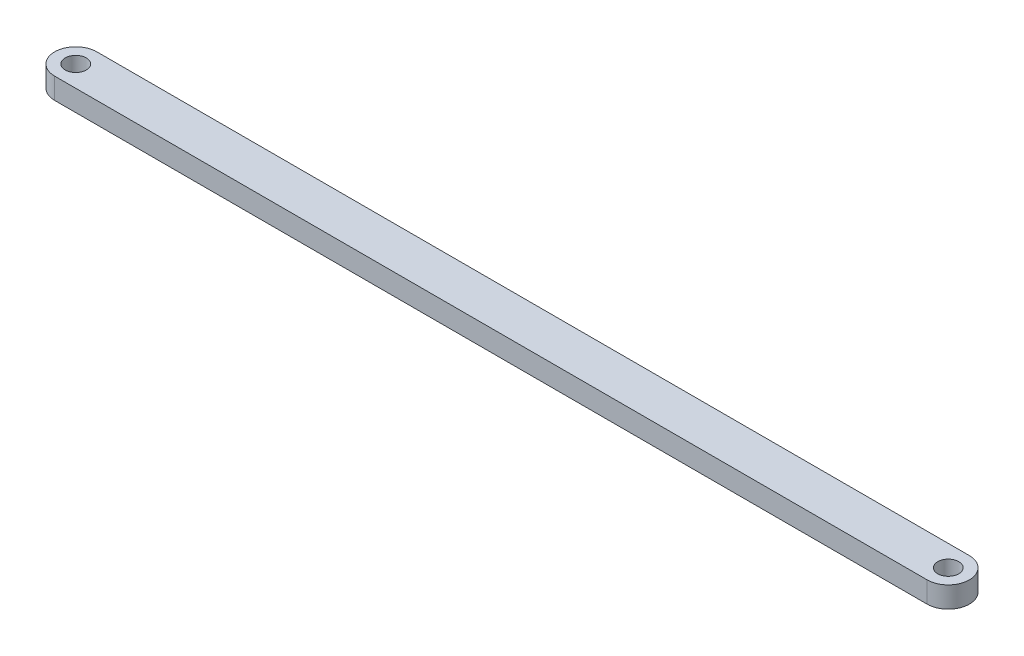
ISO-10303-21;
HEADER;
FILE_DESCRIPTION(('STEP AP214'),'2;1');
FILE_NAME('part.step','',(''),(''),'','','');
FILE_SCHEMA(('AUTOMOTIVE_DESIGN { 1 0 10303 214 1 1 1 1 }'));
ENDSEC;
DATA;
#1=APPLICATION_CONTEXT('core data for automotive mechanical design processes');
#2=APPLICATION_PROTOCOL_DEFINITION('international standard','automotive_design',2000,#1);
#3=PRODUCT_CONTEXT('',#1,'mechanical');
#4=PRODUCT('Part','Part','',(#3));
#5=PRODUCT_RELATED_PRODUCT_CATEGORY('part','',(#4));
#6=PRODUCT_DEFINITION_FORMATION('','',#4);
#7=PRODUCT_DEFINITION_CONTEXT('part definition',#1,'design');
#8=PRODUCT_DEFINITION('design','',#6,#7);
#9=PRODUCT_DEFINITION_SHAPE('','',#8);
#10=(LENGTH_UNIT() NAMED_UNIT(*) SI_UNIT(.MILLI.,.METRE.));
#11=(NAMED_UNIT(*) PLANE_ANGLE_UNIT() SI_UNIT($,.RADIAN.));
#12=(NAMED_UNIT(*) SI_UNIT($,.STERADIAN.) SOLID_ANGLE_UNIT());
#13=UNCERTAINTY_MEASURE_WITH_UNIT(LENGTH_MEASURE(1.E-05),#10,'distance_accuracy_value','');
#14=(GEOMETRIC_REPRESENTATION_CONTEXT(3) GLOBAL_UNCERTAINTY_ASSIGNED_CONTEXT((#13)) GLOBAL_UNIT_ASSIGNED_CONTEXT((#10,
#11,#12)) REPRESENTATION_CONTEXT('',''));
#15=CARTESIAN_POINT('',(0.,0.,0.));
#16=DIRECTION('',(0.,0.,1.));
#17=DIRECTION('',(1.,0.,0.));
#18=AXIS2_PLACEMENT_3D('',#15,#16,#17);
#19=CARTESIAN_POINT('',(0.,5.,5.));
#20=DIRECTION('',(0.,0.,-1.));
#21=DIRECTION('',(-1.,0.,0.));
#22=AXIS2_PLACEMENT_3D('',#19,#20,#21);
#23=PLANE('',#22);
#24=DIRECTION('',(1.,0.,0.));
#25=VECTOR('',#24,1.);
#26=CARTESIAN_POINT('',(0.,0.,5.));
#27=LINE('',#26,#25);
#28=CARTESIAN_POINT('',(0.,0.,5.));
#29=VERTEX_POINT('',#28);
#30=CARTESIAN_POINT('',(207.06,0.,5.00000000000001));
#31=VERTEX_POINT('',#30);
#32=EDGE_CURVE('E121',#29,#31,#27,.T.);
#33=ORIENTED_EDGE('',*,*,#32,.T.);
#34=DIRECTION('',(0.,-1.,0.));
#35=VECTOR('',#34,1.);
#36=CARTESIAN_POINT('',(207.06,5.,5.00000000000001));
#37=LINE('',#36,#35);
#38=CARTESIAN_POINT('',(207.06,5.,5.00000000000001));
#39=VERTEX_POINT('',#38);
#40=EDGE_CURVE('E11',#39,#31,#37,.T.);
#41=ORIENTED_EDGE('',*,*,#40,.F.);
#42=DIRECTION('',(1.,0.,0.));
#43=VECTOR('',#42,1.);
#44=CARTESIAN_POINT('',(0.,5.,5.));
#45=LINE('',#44,#43);
#46=CARTESIAN_POINT('',(0.,5.,5.));
#47=VERTEX_POINT('',#46);
#48=EDGE_CURVE('E94',#47,#39,#45,.T.);
#49=ORIENTED_EDGE('',*,*,#48,.F.);
#50=DIRECTION('',(0.,-1.,0.));
#51=VECTOR('',#50,1.);
#52=CARTESIAN_POINT('',(0.,5.,5.));
#53=LINE('',#52,#51);
#54=EDGE_CURVE('E120',#47,#29,#53,.T.);
#55=ORIENTED_EDGE('',*,*,#54,.T.);
#56=EDGE_LOOP('',(#33,#41,#49,#55));
#57=FACE_BOUND('',#56,.T.);
#58=ADVANCED_FACE('F45',(#57),#23,.F.);
#59=CARTESIAN_POINT('',(207.06,5.,0.));
#60=DIRECTION('',(0.,-1.,0.));
#61=DIRECTION('',(0.,0.,-1.));
#62=AXIS2_PLACEMENT_3D('',#59,#60,#61);
#63=CYLINDRICAL_SURFACE('',#62,5.00000000000002);
#64=CARTESIAN_POINT('',(207.06,0.,0.));
#65=DIRECTION('',(0.,1.,0.));
#66=DIRECTION('',(0.,0.,1.));
#67=AXIS2_PLACEMENT_3D('',#64,#65,#66);
#68=CIRCLE('',#67,5.00000000000002);
#69=CARTESIAN_POINT('',(207.06,0.,-5.00000000000001));
#70=VERTEX_POINT('',#69);
#71=EDGE_CURVE('E100',#31,#70,#68,.T.);
#72=ORIENTED_EDGE('',*,*,#71,.T.);
#73=DIRECTION('',(0.,-1.,0.));
#74=VECTOR('',#73,1.);
#75=CARTESIAN_POINT('',(207.06,5.,-5.00000000000001));
#76=LINE('',#75,#74);
#77=CARTESIAN_POINT('',(207.06,5.,-5.00000000000001));
#78=VERTEX_POINT('',#77);
#79=EDGE_CURVE('E54',#78,#70,#76,.T.);
#80=ORIENTED_EDGE('',*,*,#79,.F.);
#81=CARTESIAN_POINT('',(207.06,5.,0.));
#82=DIRECTION('',(0.,1.,0.));
#83=DIRECTION('',(0.,0.,1.));
#84=AXIS2_PLACEMENT_3D('',#81,#82,#83);
#85=CIRCLE('',#84,5.00000000000002);
#86=EDGE_CURVE('E88',#39,#78,#85,.T.);
#87=ORIENTED_EDGE('',*,*,#86,.F.);
#88=ORIENTED_EDGE('',*,*,#40,.T.);
#89=EDGE_LOOP('',(#72,#80,#87,#88));
#90=FACE_BOUND('',#89,.T.);
#91=ADVANCED_FACE('F99',(#90),#63,.T.);
#92=CARTESIAN_POINT('',(0.,5.,-5.));
#93=DIRECTION('',(0.,0.,-1.));
#94=DIRECTION('',(-1.,0.,0.));
#95=AXIS2_PLACEMENT_3D('',#92,#93,#94);
#96=PLANE('',#95);
#97=DIRECTION('',(1.,0.,0.));
#98=VECTOR('',#97,1.);
#99=CARTESIAN_POINT('',(0.,0.,-5.));
#100=LINE('',#99,#98);
#101=CARTESIAN_POINT('',(0.,0.,-5.));
#102=VERTEX_POINT('',#101);
#103=EDGE_CURVE('E127',#102,#70,#100,.T.);
#104=ORIENTED_EDGE('',*,*,#103,.F.);
#105=DIRECTION('',(0.,-1.,0.));
#106=VECTOR('',#105,1.);
#107=CARTESIAN_POINT('',(0.,5.,-5.));
#108=LINE('',#107,#106);
#109=CARTESIAN_POINT('',(0.,5.,-5.));
#110=VERTEX_POINT('',#109);
#111=EDGE_CURVE('E78',#110,#102,#108,.T.);
#112=ORIENTED_EDGE('',*,*,#111,.F.);
#113=DIRECTION('',(1.,0.,0.));
#114=VECTOR('',#113,1.);
#115=CARTESIAN_POINT('',(0.,5.,-5.));
#116=LINE('',#115,#114);
#117=EDGE_CURVE('E92',#110,#78,#116,.T.);
#118=ORIENTED_EDGE('',*,*,#117,.T.);
#119=ORIENTED_EDGE('',*,*,#79,.T.);
#120=EDGE_LOOP('',(#104,#112,#118,#119));
#121=FACE_BOUND('',#120,.T.);
#122=ADVANCED_FACE('F105',(#121),#96,.T.);
#123=CARTESIAN_POINT('',(0.,5.,0.));
#124=DIRECTION('',(0.,-1.,0.));
#125=DIRECTION('',(0.,0.,-1.));
#126=AXIS2_PLACEMENT_3D('',#123,#124,#125);
#127=CYLINDRICAL_SURFACE('',#126,2.5);
#128=CARTESIAN_POINT('',(0.,5.,0.));
#129=DIRECTION('',(0.,1.,0.));
#130=DIRECTION('',(0.,0.,1.));
#131=AXIS2_PLACEMENT_3D('',#128,#129,#130);
#132=CIRCLE('',#131,2.5);
#133=CARTESIAN_POINT('',(0.,5.,2.5));
#134=VERTEX_POINT('',#133);
#135=EDGE_CURVE('E109',#134,#134,#132,.T.);
#136=ORIENTED_EDGE('',*,*,#135,.T.);
#137=EDGE_LOOP('',(#136));
#138=FACE_BOUND('',#137,.T.);
#139=CARTESIAN_POINT('',(0.,0.,0.));
#140=DIRECTION('',(0.,1.,0.));
#141=DIRECTION('',(0.,0.,1.));
#142=AXIS2_PLACEMENT_3D('',#139,#140,#141);
#143=CIRCLE('',#142,2.5);
#144=CARTESIAN_POINT('',(0.,0.,2.5));
#145=VERTEX_POINT('',#144);
#146=EDGE_CURVE('E132',#145,#145,#143,.T.);
#147=ORIENTED_EDGE('',*,*,#146,.F.);
#148=EDGE_LOOP('',(#147));
#149=FACE_BOUND('',#148,.T.);
#150=ADVANCED_FACE('F164',(#138,#149),#127,.F.);
#151=CARTESIAN_POINT('',(0.,5.,0.));
#152=DIRECTION('',(0.,-1.,0.));
#153=DIRECTION('',(0.,0.,-1.));
#154=AXIS2_PLACEMENT_3D('',#151,#152,#153);
#155=CYLINDRICAL_SURFACE('',#154,5.);
#156=CARTESIAN_POINT('',(0.,0.,0.));
#157=DIRECTION('',(0.,1.,0.));
#158=DIRECTION('',(0.,0.,1.));
#159=AXIS2_PLACEMENT_3D('',#156,#157,#158);
#160=CIRCLE('',#159,5.);
#161=EDGE_CURVE('E81',#102,#29,#160,.T.);
#162=ORIENTED_EDGE('',*,*,#161,.T.);
#163=ORIENTED_EDGE('',*,*,#54,.F.);
#164=CARTESIAN_POINT('',(0.,5.,0.));
#165=DIRECTION('',(0.,1.,0.));
#166=DIRECTION('',(0.,0.,1.));
#167=AXIS2_PLACEMENT_3D('',#164,#165,#166);
#168=CIRCLE('',#167,5.);
#169=EDGE_CURVE('E62',#110,#47,#168,.T.);
#170=ORIENTED_EDGE('',*,*,#169,.F.);
#171=ORIENTED_EDGE('',*,*,#111,.T.);
#172=EDGE_LOOP('',(#162,#163,#170,#171));
#173=FACE_BOUND('',#172,.T.);
#174=ADVANCED_FACE('F156',(#173),#155,.T.);
#175=CARTESIAN_POINT('',(207.06,5.,0.));
#176=DIRECTION('',(0.,-1.,0.));
#177=DIRECTION('',(0.,0.,-1.));
#178=AXIS2_PLACEMENT_3D('',#175,#176,#177);
#179=CYLINDRICAL_SURFACE('',#178,2.5);
#180=CARTESIAN_POINT('',(207.06,5.,0.));
#181=DIRECTION('',(0.,1.,0.));
#182=DIRECTION('',(0.,0.,1.));
#183=AXIS2_PLACEMENT_3D('',#180,#181,#182);
#184=CIRCLE('',#183,2.5);
#185=CARTESIAN_POINT('',(207.06,5.,2.5));
#186=VERTEX_POINT('',#185);
#187=EDGE_CURVE('E116',#186,#186,#184,.T.);
#188=ORIENTED_EDGE('',*,*,#187,.T.);
#189=EDGE_LOOP('',(#188));
#190=FACE_BOUND('',#189,.T.);
#191=CARTESIAN_POINT('',(207.06,0.,0.));
#192=DIRECTION('',(0.,1.,0.));
#193=DIRECTION('',(0.,0.,1.));
#194=AXIS2_PLACEMENT_3D('',#191,#192,#193);
#195=CIRCLE('',#194,2.5);
#196=CARTESIAN_POINT('',(207.06,0.,2.5));
#197=VERTEX_POINT('',#196);
#198=EDGE_CURVE('E136',#197,#197,#195,.T.);
#199=ORIENTED_EDGE('',*,*,#198,.F.);
#200=EDGE_LOOP('',(#199));
#201=FACE_BOUND('',#200,.T.);
#202=ADVANCED_FACE('F154',(#190,#201),#179,.F.);
#203=CARTESIAN_POINT('',(0.,5.,0.));
#204=DIRECTION('',(0.,1.,0.));
#205=DIRECTION('',(0.,0.,1.));
#206=AXIS2_PLACEMENT_3D('',#203,#204,#205);
#207=PLANE('',#206);
#208=ORIENTED_EDGE('',*,*,#48,.T.);
#209=ORIENTED_EDGE('',*,*,#86,.T.);
#210=ORIENTED_EDGE('',*,*,#117,.F.);
#211=ORIENTED_EDGE('',*,*,#169,.T.);
#212=EDGE_LOOP('',(#208,#209,#210,#211));
#213=FACE_BOUND('',#212,.T.);
#214=ORIENTED_EDGE('',*,*,#135,.F.);
#215=EDGE_LOOP('',(#214));
#216=FACE_BOUND('',#215,.T.);
#217=ORIENTED_EDGE('',*,*,#187,.F.);
#218=EDGE_LOOP('',(#217));
#219=FACE_BOUND('',#218,.T.);
#220=ADVANCED_FACE('F89',(#213,#216,#219),#207,.T.);
#221=CARTESIAN_POINT('',(0.,0.,0.));
#222=DIRECTION('',(0.,1.,0.));
#223=DIRECTION('',(0.,0.,1.));
#224=AXIS2_PLACEMENT_3D('',#221,#222,#223);
#225=PLANE('',#224);
#226=ORIENTED_EDGE('',*,*,#32,.F.);
#227=ORIENTED_EDGE('',*,*,#161,.F.);
#228=ORIENTED_EDGE('',*,*,#103,.T.);
#229=ORIENTED_EDGE('',*,*,#71,.F.);
#230=EDGE_LOOP('',(#226,#227,#228,#229));
#231=FACE_BOUND('',#230,.T.);
#232=ORIENTED_EDGE('',*,*,#146,.T.);
#233=EDGE_LOOP('',(#232));
#234=FACE_BOUND('',#233,.T.);
#235=ORIENTED_EDGE('',*,*,#198,.T.);
#236=EDGE_LOOP('',(#235));
#237=FACE_BOUND('',#236,.T.);
#238=ADVANCED_FACE('F146',(#231,#234,#237),#225,.F.);
#239=CLOSED_SHELL('',(#58,#91,#122,#150,#174,#202,#220,#238));
#240=MANIFOLD_SOLID_BREP('B2',#239);
#241=ADVANCED_BREP_SHAPE_REPRESENTATION('',(#18,#240),#14);
#242=SHAPE_DEFINITION_REPRESENTATION(#9,#241);
ENDSEC;
END-ISO-10303-21;
